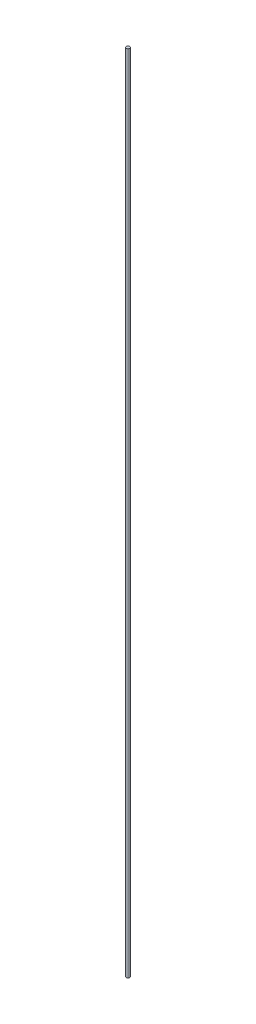
ISO-10303-21;
HEADER;
FILE_DESCRIPTION(('STEP AP214'),'2;1');
FILE_NAME('part.step','',(''),(''),'','','');
FILE_SCHEMA(('AUTOMOTIVE_DESIGN { 1 0 10303 214 1 1 1 1 }'));
ENDSEC;
DATA;
#1=APPLICATION_CONTEXT('core data for automotive mechanical design processes');
#2=APPLICATION_PROTOCOL_DEFINITION('international standard','automotive_design',2000,#1);
#3=PRODUCT_CONTEXT('',#1,'mechanical');
#4=PRODUCT('Part','Part','',(#3));
#5=PRODUCT_RELATED_PRODUCT_CATEGORY('part','',(#4));
#6=PRODUCT_DEFINITION_FORMATION('','',#4);
#7=PRODUCT_DEFINITION_CONTEXT('part definition',#1,'design');
#8=PRODUCT_DEFINITION('design','',#6,#7);
#9=PRODUCT_DEFINITION_SHAPE('','',#8);
#10=(LENGTH_UNIT() NAMED_UNIT(*) SI_UNIT(.MILLI.,.METRE.));
#11=(NAMED_UNIT(*) PLANE_ANGLE_UNIT() SI_UNIT($,.RADIAN.));
#12=(NAMED_UNIT(*) SI_UNIT($,.STERADIAN.) SOLID_ANGLE_UNIT());
#13=UNCERTAINTY_MEASURE_WITH_UNIT(LENGTH_MEASURE(1.E-05),#10,'distance_accuracy_value','');
#14=(GEOMETRIC_REPRESENTATION_CONTEXT(3) GLOBAL_UNCERTAINTY_ASSIGNED_CONTEXT((#13)) GLOBAL_UNIT_ASSIGNED_CONTEXT((#10,
#11,#12)) REPRESENTATION_CONTEXT('',''));
#15=CARTESIAN_POINT('',(0.,0.,0.));
#16=DIRECTION('',(0.,0.,1.));
#17=DIRECTION('',(1.,0.,0.));
#18=AXIS2_PLACEMENT_3D('',#15,#16,#17);
#19=CARTESIAN_POINT('',(0.,377.,0.));
#20=DIRECTION('',(0.,-1.,0.));
#21=DIRECTION('',(0.,0.,-1.));
#22=AXIS2_PLACEMENT_3D('',#19,#20,#21);
#23=PLANE('',#22);
#24=CARTESIAN_POINT('',(0.,377.,0.));
#25=DIRECTION('',(0.,-1.,0.));
#26=DIRECTION('',(1.,0.,0.));
#27=AXIS2_PLACEMENT_3D('',#24,#25,#26);
#28=CIRCLE('',#27,0.8000000000001);
#29=CARTESIAN_POINT('',(0.8000000000001,377.,0.));
#30=VERTEX_POINT('',#29);
#31=EDGE_CURVE('E11',#30,#30,#28,.T.);
#32=ORIENTED_EDGE('',*,*,#31,.F.);
#33=EDGE_LOOP('',(#32));
#34=FACE_BOUND('',#33,.T.);
#35=ADVANCED_FACE('F17',(#34),#23,.F.);
#36=CARTESIAN_POINT('',(0.,395.85,0.));
#37=DIRECTION('',(0.,-1.,0.));
#38=DIRECTION('',(-1.,0.,0.));
#39=AXIS2_PLACEMENT_3D('',#36,#37,#38);
#40=CYLINDRICAL_SURFACE('',#39,0.8000000000001);
#41=CARTESIAN_POINT('',(0.,0.,0.));
#42=DIRECTION('',(0.,1.,0.));
#43=DIRECTION('',(1.,0.,0.));
#44=AXIS2_PLACEMENT_3D('',#41,#42,#43);
#45=CIRCLE('',#44,0.8000000000001);
#46=CARTESIAN_POINT('',(0.8000000000001,0.,0.));
#47=VERTEX_POINT('',#46);
#48=EDGE_CURVE('E41',#47,#47,#45,.T.);
#49=ORIENTED_EDGE('',*,*,#48,.T.);
#50=DIRECTION('',(0.,1.,0.));
#51=VECTOR('',#50,1.);
#52=CARTESIAN_POINT('',(0.8000000000001,395.85,0.));
#53=LINE('',#52,#51);
#54=EDGE_CURVE('E25',#47,#30,#53,.T.);
#55=ORIENTED_EDGE('',*,*,#54,.T.);
#56=ORIENTED_EDGE('',*,*,#31,.T.);
#57=ORIENTED_EDGE('',*,*,#54,.F.);
#58=EDGE_LOOP('',(#49,#55,#56,#57));
#59=FACE_BOUND('',#58,.T.);
#60=ADVANCED_FACE('F39',(#59),#40,.T.);
#61=CARTESIAN_POINT('',(0.,0.,0.));
#62=DIRECTION('',(0.,-1.,0.));
#63=DIRECTION('',(0.,0.,-1.));
#64=AXIS2_PLACEMENT_3D('',#61,#62,#63);
#65=PLANE('',#64);
#66=ORIENTED_EDGE('',*,*,#48,.F.);
#67=EDGE_LOOP('',(#66));
#68=FACE_BOUND('',#67,.T.);
#69=ADVANCED_FACE('F64',(#68),#65,.T.);
#70=CLOSED_SHELL('',(#35,#60,#69));
#71=MANIFOLD_SOLID_BREP('B1',#70);
#72=ADVANCED_BREP_SHAPE_REPRESENTATION('',(#18,#71),#14);
#73=SHAPE_DEFINITION_REPRESENTATION(#9,#72);
ENDSEC;
END-ISO-10303-21;
